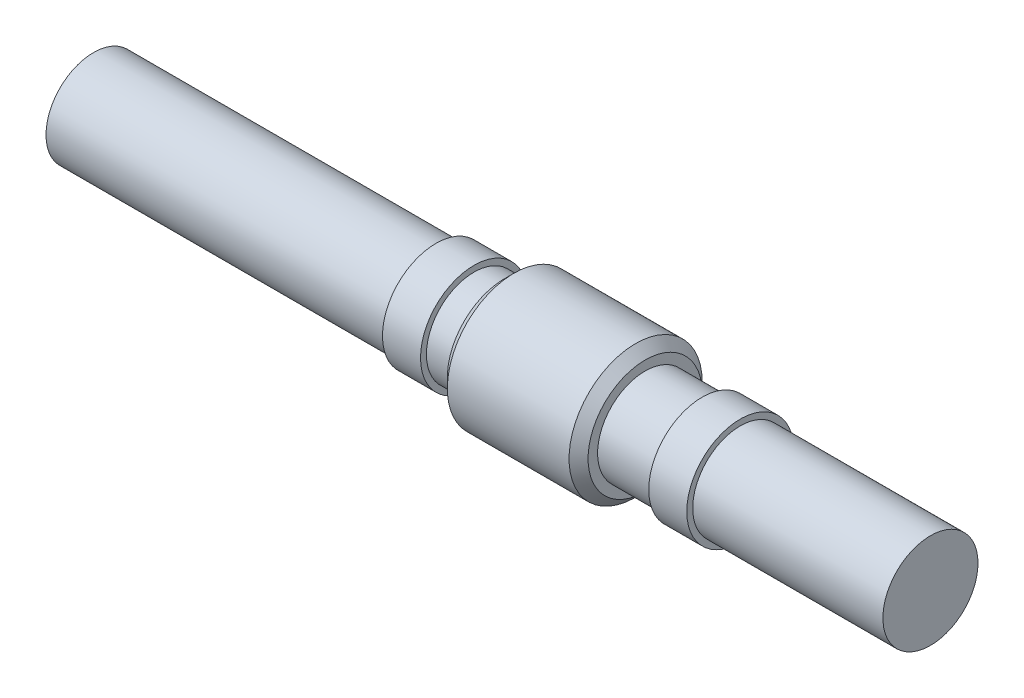
ISO-10303-21;
HEADER;
FILE_DESCRIPTION(('STEP AP214'),'2;1');
FILE_NAME('part.step','',(''),(''),'','','');
FILE_SCHEMA(('AUTOMOTIVE_DESIGN { 1 0 10303 214 1 1 1 1 }'));
ENDSEC;
DATA;
#1=APPLICATION_CONTEXT('core data for automotive mechanical design processes');
#2=APPLICATION_PROTOCOL_DEFINITION('international standard','automotive_design',2000,#1);
#3=PRODUCT_CONTEXT('',#1,'mechanical');
#4=PRODUCT('Part','Part','',(#3));
#5=PRODUCT_RELATED_PRODUCT_CATEGORY('part','',(#4));
#6=PRODUCT_DEFINITION_FORMATION('','',#4);
#7=PRODUCT_DEFINITION_CONTEXT('part definition',#1,'design');
#8=PRODUCT_DEFINITION('design','',#6,#7);
#9=PRODUCT_DEFINITION_SHAPE('','',#8);
#10=(LENGTH_UNIT() NAMED_UNIT(*) SI_UNIT(.MILLI.,.METRE.));
#11=(NAMED_UNIT(*) PLANE_ANGLE_UNIT() SI_UNIT($,.RADIAN.));
#12=(NAMED_UNIT(*) SI_UNIT($,.STERADIAN.) SOLID_ANGLE_UNIT());
#13=UNCERTAINTY_MEASURE_WITH_UNIT(LENGTH_MEASURE(1.E-05),#10,'distance_accuracy_value','');
#14=(GEOMETRIC_REPRESENTATION_CONTEXT(3) GLOBAL_UNCERTAINTY_ASSIGNED_CONTEXT((#13)) GLOBAL_UNIT_ASSIGNED_CONTEXT((#10,
#11,#12)) REPRESENTATION_CONTEXT('',''));
#15=CARTESIAN_POINT('',(0.,0.,0.));
#16=DIRECTION('',(0.,0.,1.));
#17=DIRECTION('',(1.,0.,0.));
#18=AXIS2_PLACEMENT_3D('',#15,#16,#17);
#19=CARTESIAN_POINT('',(187.,0.,0.));
#20=DIRECTION('',(-1.,0.,0.));
#21=DIRECTION('',(0.,0.,1.));
#22=AXIS2_PLACEMENT_3D('',#19,#20,#21);
#23=CYLINDRICAL_SURFACE('',#22,28.1);
#24=CARTESIAN_POINT('',(67.,0.,0.));
#25=DIRECTION('',(1.,0.,0.));
#26=DIRECTION('',(0.,0.,-1.));
#27=AXIS2_PLACEMENT_3D('',#24,#25,#26);
#28=CIRCLE('',#27,28.1);
#29=CARTESIAN_POINT('',(67.,0.,28.1));
#30=VERTEX_POINT('',#29);
#31=EDGE_CURVE('E273',#30,#30,#28,.T.);
#32=CARTESIAN_POINT('',(87.,0.,0.));
#33=DIRECTION('',(1.,0.,0.));
#34=DIRECTION('',(0.,0.,-1.));
#35=AXIS2_PLACEMENT_3D('',#32,#33,#34);
#36=CIRCLE('',#35,28.1);
#37=CARTESIAN_POINT('',(87.,0.,28.1));
#38=VERTEX_POINT('',#37);
#39=EDGE_CURVE('E264',#38,#38,#36,.T.);
#40=CARTESIAN_POINT('',(67.,0.,28.1));
#41=CARTESIAN_POINT('',(67.2083333333333,0.,28.1));
#42=CARTESIAN_POINT('',(67.4166666666667,0.,28.1));
#43=CARTESIAN_POINT('',(67.8333333333333,0.,28.1));
#44=CARTESIAN_POINT('',(68.0416666666667,0.,28.1));
#45=CARTESIAN_POINT('',(68.4583333333333,0.,28.1));
#46=CARTESIAN_POINT('',(68.6666666666667,0.,28.1));
#47=CARTESIAN_POINT('',(69.0833333333333,0.,28.1));
#48=CARTESIAN_POINT('',(69.2916666666667,0.,28.1));
#49=CARTESIAN_POINT('',(69.7083333333333,0.,28.1));
#50=CARTESIAN_POINT('',(69.9166666666667,0.,28.1));
#51=CARTESIAN_POINT('',(70.3333333333333,0.,28.1));
#52=CARTESIAN_POINT('',(70.5416666666667,0.,28.1));
#53=CARTESIAN_POINT('',(70.9583333333333,0.,28.1));
#54=CARTESIAN_POINT('',(71.1666666666667,0.,28.1));
#55=CARTESIAN_POINT('',(71.5833333333333,0.,28.1));
#56=CARTESIAN_POINT('',(71.7916666666667,0.,28.1));
#57=CARTESIAN_POINT('',(72.2083333333333,0.,28.1));
#58=CARTESIAN_POINT('',(72.4166666666667,0.,28.1));
#59=CARTESIAN_POINT('',(72.8333333333333,0.,28.1));
#60=CARTESIAN_POINT('',(73.0416666666666,0.,28.1));
#61=CARTESIAN_POINT('',(73.4583333333333,0.,28.1));
#62=CARTESIAN_POINT('',(73.6666666666666,0.,28.1));
#63=CARTESIAN_POINT('',(74.0833333333333,0.,28.1));
#64=CARTESIAN_POINT('',(74.2916666666666,0.,28.1));
#65=CARTESIAN_POINT('',(74.7083333333333,0.,28.1));
#66=CARTESIAN_POINT('',(74.9166666666666,0.,28.1));
#67=CARTESIAN_POINT('',(75.3333333333333,0.,28.1));
#68=CARTESIAN_POINT('',(75.5416666666666,0.,28.1));
#69=CARTESIAN_POINT('',(75.9583333333333,0.,28.1));
#70=CARTESIAN_POINT('',(76.1666666666666,0.,28.1));
#71=CARTESIAN_POINT('',(76.5833333333333,0.,28.1));
#72=CARTESIAN_POINT('',(76.7916666666666,0.,28.1));
#73=CARTESIAN_POINT('',(77.2083333333333,0.,28.1));
#74=CARTESIAN_POINT('',(77.4166666666666,0.,28.1));
#75=CARTESIAN_POINT('',(77.8333333333333,0.,28.1));
#76=CARTESIAN_POINT('',(78.0416666666666,0.,28.1));
#77=CARTESIAN_POINT('',(78.4583333333333,0.,28.1));
#78=CARTESIAN_POINT('',(78.6666666666666,0.,28.1));
#79=CARTESIAN_POINT('',(79.0833333333333,0.,28.1));
#80=CARTESIAN_POINT('',(79.2916666666666,0.,28.1));
#81=CARTESIAN_POINT('',(79.7083333333333,0.,28.1));
#82=CARTESIAN_POINT('',(79.9166666666666,0.,28.1));
#83=CARTESIAN_POINT('',(80.3333333333333,0.,28.1));
#84=CARTESIAN_POINT('',(80.5416666666667,0.,28.1));
#85=CARTESIAN_POINT('',(80.9583333333333,0.,28.1));
#86=CARTESIAN_POINT('',(81.1666666666667,0.,28.1));
#87=CARTESIAN_POINT('',(81.5833333333333,0.,28.1));
#88=CARTESIAN_POINT('',(81.7916666666667,0.,28.1));
#89=CARTESIAN_POINT('',(82.2083333333333,0.,28.1));
#90=CARTESIAN_POINT('',(82.4166666666667,0.,28.1));
#91=CARTESIAN_POINT('',(82.8333333333333,0.,28.1));
#92=CARTESIAN_POINT('',(83.0416666666667,0.,28.1));
#93=CARTESIAN_POINT('',(83.4583333333333,0.,28.1));
#94=CARTESIAN_POINT('',(83.6666666666666,0.,28.1));
#95=CARTESIAN_POINT('',(84.0833333333333,0.,28.1));
#96=CARTESIAN_POINT('',(84.2916666666666,0.,28.1));
#97=CARTESIAN_POINT('',(84.7083333333333,0.,28.1));
#98=CARTESIAN_POINT('',(84.9166666666666,0.,28.1));
#99=CARTESIAN_POINT('',(85.3333333333333,0.,28.1));
#100=CARTESIAN_POINT('',(85.5416666666666,0.,28.1));
#101=CARTESIAN_POINT('',(85.9583333333333,0.,28.1));
#102=CARTESIAN_POINT('',(86.1666666666666,0.,28.1));
#103=CARTESIAN_POINT('',(86.5833333333333,0.,28.1));
#104=CARTESIAN_POINT('',(86.7916666666666,0.,28.1));
#105=CARTESIAN_POINT('',(87.,0.,28.1));
#106=B_SPLINE_CURVE_WITH_KNOTS('',3,(#40,#41,#42,#43,#44,#45,#46,#47,#48,#49,#50,#51,#52,#53,
#54,#55,#56,#57,#58,#59,#60,#61,#62,#63,#64,#65,#66,#67,#68,#69,#70,#71,#72,#73,#74,#75,#76,#77,
#78,#79,#80,#81,#82,#83,#84,#85,#86,#87,#88,#89,#90,#91,#92,#93,#94,#95,#96,#97,#98,#99,#100,
#101,#102,#103,#104,#105),.UNSPECIFIED.,.F.,.F.,(4,2,2,2,2,2,2,2,2,2,2,2,2,2,2,2,2,2,2,2,2,2,2,
2,2,2,2,2,2,2,2,2,4),(0.,0.625000000000001,1.25,1.875,2.5,3.125,3.75,4.375,5.,5.62499999999999,
6.24999999999999,6.87499999999999,7.49999999999999,8.12499999999999,8.74999999999999,
9.37499999999999,9.99999999999999,10.625,11.25,11.875,12.5,13.125,13.75,14.375,15.,15.625,16.25,
16.875,17.5,18.125,18.75,19.375,20.),.UNSPECIFIED.);
#107=EDGE_CURVE('BSEAM33',#30,#38,#106,.T.);
#108=ORIENTED_EDGE('',*,*,#31,.T.);
#109=ORIENTED_EDGE('',*,*,#39,.F.);
#110=ORIENTED_EDGE('',*,*,#107,.T.);
#111=ORIENTED_EDGE('',*,*,#107,.F.);
#112=EDGE_LOOP('',(#108,#110,#109,#111));
#113=FACE_BOUND('',#112,.T.);
#114=ADVANCED_FACE('F33',(#113),#23,.T.);
#115=CARTESIAN_POINT('',(-173.,0.,0.));
#116=DIRECTION('',(1.,0.,0.));
#117=DIRECTION('',(0.,0.,-1.));
#118=AXIS2_PLACEMENT_3D('',#115,#116,#117);
#119=CYLINDRICAL_SURFACE('',#118,28.1);
#120=CARTESIAN_POINT('',(-53.,0.,0.));
#121=DIRECTION('',(-1.,0.,0.));
#122=DIRECTION('',(0.,0.,1.));
#123=AXIS2_PLACEMENT_3D('',#120,#121,#122);
#124=CIRCLE('',#123,28.1);
#125=CARTESIAN_POINT('',(-53.,0.,28.1));
#126=VERTEX_POINT('',#125);
#127=EDGE_CURVE('E52',#126,#126,#124,.T.);
#128=ORIENTED_EDGE('',*,*,#127,.T.);
#129=EDGE_LOOP('',(#128));
#130=FACE_BOUND('',#129,.T.);
#131=CARTESIAN_POINT('',(-73.,0.,0.));
#132=DIRECTION('',(-1.,0.,0.));
#133=DIRECTION('',(0.,0.,1.));
#134=AXIS2_PLACEMENT_3D('',#131,#132,#133);
#135=CIRCLE('',#134,28.1);
#136=CARTESIAN_POINT('',(-73.,0.,28.1));
#137=VERTEX_POINT('',#136);
#138=EDGE_CURVE('E271',#137,#137,#135,.T.);
#139=ORIENTED_EDGE('',*,*,#138,.F.);
#140=EDGE_LOOP('',(#139));
#141=FACE_BOUND('',#140,.T.);
#142=ADVANCED_FACE('F81',(#130,#141),#119,.T.);
#143=CARTESIAN_POINT('',(37.,0.,0.));
#144=DIRECTION('',(-1.,0.,0.));
#145=DIRECTION('',(0.,0.,1.));
#146=AXIS2_PLACEMENT_3D('',#143,#144,#145);
#147=CYLINDRICAL_SURFACE('',#146,35.);
#148=CARTESIAN_POINT('',(32.,0.,0.));
#149=DIRECTION('',(1.,0.,0.));
#150=DIRECTION('',(0.,0.,-1.));
#151=AXIS2_PLACEMENT_3D('',#148,#149,#150);
#152=CIRCLE('',#151,35.);
#153=CARTESIAN_POINT('',(32.,0.,-35.));
#154=VERTEX_POINT('',#153);
#155=EDGE_CURVE('E63',#154,#154,#152,.F.);
#156=ORIENTED_EDGE('',*,*,#155,.T.);
#157=EDGE_LOOP('',(#156));
#158=FACE_BOUND('',#157,.T.);
#159=CARTESIAN_POINT('',(-32.,0.,0.));
#160=DIRECTION('',(1.,0.,0.));
#161=DIRECTION('',(0.,0.,-1.));
#162=AXIS2_PLACEMENT_3D('',#159,#160,#161);
#163=CIRCLE('',#162,35.);
#164=CARTESIAN_POINT('',(-32.,0.,-35.));
#165=VERTEX_POINT('',#164);
#166=EDGE_CURVE('E61',#165,#165,#163,.T.);
#167=ORIENTED_EDGE('',*,*,#166,.T.);
#168=EDGE_LOOP('',(#167));
#169=FACE_BOUND('',#168,.T.);
#170=ADVANCED_FACE('F78',(#158,#169),#147,.T.);
#171=CARTESIAN_POINT('',(37.,0.,0.));
#172=DIRECTION('',(1.,0.,0.));
#173=DIRECTION('',(0.,0.,-1.));
#174=AXIS2_PLACEMENT_3D('',#171,#172,#173);
#175=PLANE('',#174);
#176=CARTESIAN_POINT('',(37.,0.,0.));
#177=DIRECTION('',(1.,0.,0.));
#178=DIRECTION('',(0.,0.,-1.));
#179=AXIS2_PLACEMENT_3D('',#176,#177,#178);
#180=CIRCLE('',#179,25.);
#181=CARTESIAN_POINT('',(37.,0.,-25.));
#182=VERTEX_POINT('',#181);
#183=EDGE_CURVE('E10',#182,#182,#180,.T.);
#184=ORIENTED_EDGE('',*,*,#183,.F.);
#185=EDGE_LOOP('',(#184));
#186=FACE_BOUND('',#185,.T.);
#187=CARTESIAN_POINT('',(37.,0.,0.));
#188=DIRECTION('',(1.,0.,0.));
#189=DIRECTION('',(0.,0.,-1.));
#190=AXIS2_PLACEMENT_3D('',#187,#188,#189);
#191=CIRCLE('',#190,30.);
#192=CARTESIAN_POINT('',(37.,0.,-30.));
#193=VERTEX_POINT('',#192);
#194=EDGE_CURVE('E57',#193,#193,#191,.T.);
#195=ORIENTED_EDGE('',*,*,#194,.T.);
#196=EDGE_LOOP('',(#195));
#197=FACE_BOUND('',#196,.T.);
#198=ADVANCED_FACE('F80',(#186,#197),#175,.T.);
#199=CARTESIAN_POINT('',(-37.,0.,0.));
#200=DIRECTION('',(1.,0.,0.));
#201=DIRECTION('',(0.,0.,-1.));
#202=AXIS2_PLACEMENT_3D('',#199,#200,#201);
#203=PLANE('',#202);
#204=CARTESIAN_POINT('',(-37.,0.,0.));
#205=DIRECTION('',(-1.,0.,0.));
#206=DIRECTION('',(0.,0.,1.));
#207=AXIS2_PLACEMENT_3D('',#204,#205,#206);
#208=CIRCLE('',#207,25.);
#209=CARTESIAN_POINT('',(-37.,0.,25.));
#210=VERTEX_POINT('',#209);
#211=EDGE_CURVE('E42',#210,#210,#208,.T.);
#212=ORIENTED_EDGE('',*,*,#211,.F.);
#213=EDGE_LOOP('',(#212));
#214=FACE_BOUND('',#213,.T.);
#215=CARTESIAN_POINT('',(-37.,0.,0.));
#216=DIRECTION('',(1.,0.,0.));
#217=DIRECTION('',(0.,0.,-1.));
#218=AXIS2_PLACEMENT_3D('',#215,#216,#217);
#219=CIRCLE('',#218,30.);
#220=CARTESIAN_POINT('',(-37.,0.,-30.));
#221=VERTEX_POINT('',#220);
#222=EDGE_CURVE('E38',#221,#221,#219,.F.);
#223=ORIENTED_EDGE('',*,*,#222,.T.);
#224=EDGE_LOOP('',(#223));
#225=FACE_BOUND('',#224,.T.);
#226=ADVANCED_FACE('F70',(#214,#225),#203,.F.);
#227=CARTESIAN_POINT('',(37.,0.,0.));
#228=DIRECTION('',(-1.,0.,0.));
#229=DIRECTION('',(0.,0.,1.));
#230=AXIS2_PLACEMENT_3D('',#227,#228,#229);
#231=CONICAL_SURFACE('',#230,30.,0.785398163397446);
#232=ORIENTED_EDGE('',*,*,#155,.F.);
#233=EDGE_LOOP('',(#232));
#234=FACE_BOUND('',#233,.T.);
#235=ORIENTED_EDGE('',*,*,#194,.F.);
#236=EDGE_LOOP('',(#235));
#237=FACE_BOUND('',#236,.T.);
#238=ADVANCED_FACE('F75',(#234,#237),#231,.T.);
#239=CARTESIAN_POINT('',(-32.,0.,0.));
#240=DIRECTION('',(1.,0.,0.));
#241=DIRECTION('',(0.,0.,-1.));
#242=AXIS2_PLACEMENT_3D('',#239,#240,#241);
#243=CONICAL_SURFACE('',#242,35.,0.78539816339745);
#244=ORIENTED_EDGE('',*,*,#222,.F.);
#245=EDGE_LOOP('',(#244));
#246=FACE_BOUND('',#245,.T.);
#247=ORIENTED_EDGE('',*,*,#166,.F.);
#248=EDGE_LOOP('',(#247));
#249=FACE_BOUND('',#248,.T.);
#250=ADVANCED_FACE('F36',(#246,#249),#243,.T.);
#251=CARTESIAN_POINT('',(-53.,0.,0.));
#252=DIRECTION('',(1.,0.,0.));
#253=DIRECTION('',(0.,0.,-1.));
#254=AXIS2_PLACEMENT_3D('',#251,#252,#253);
#255=CYLINDRICAL_SURFACE('',#254,25.);
#256=CARTESIAN_POINT('',(-53.,0.,0.));
#257=DIRECTION('',(-1.,0.,0.));
#258=DIRECTION('',(0.,0.,1.));
#259=AXIS2_PLACEMENT_3D('',#256,#257,#258);
#260=CIRCLE('',#259,25.);
#261=CARTESIAN_POINT('',(-53.,0.,25.));
#262=VERTEX_POINT('',#261);
#263=EDGE_CURVE('E55',#262,#262,#260,.T.);
#264=ORIENTED_EDGE('',*,*,#263,.F.);
#265=EDGE_LOOP('',(#264));
#266=FACE_BOUND('',#265,.T.);
#267=ORIENTED_EDGE('',*,*,#211,.T.);
#268=EDGE_LOOP('',(#267));
#269=FACE_BOUND('',#268,.T.);
#270=ADVANCED_FACE('F74',(#266,#269),#255,.T.);
#271=CARTESIAN_POINT('',(-53.,0.,0.));
#272=DIRECTION('',(-1.,0.,0.));
#273=DIRECTION('',(0.,0.,1.));
#274=AXIS2_PLACEMENT_3D('',#271,#272,#273);
#275=PLANE('',#274);
#276=ORIENTED_EDGE('',*,*,#263,.T.);
#277=EDGE_LOOP('',(#276));
#278=FACE_BOUND('',#277,.T.);
#279=ORIENTED_EDGE('',*,*,#127,.F.);
#280=EDGE_LOOP('',(#279));
#281=FACE_BOUND('',#280,.T.);
#282=ADVANCED_FACE('F106',(#278,#281),#275,.F.);
#283=CARTESIAN_POINT('',(67.,0.,0.));
#284=DIRECTION('',(-1.,0.,0.));
#285=DIRECTION('',(0.,0.,1.));
#286=AXIS2_PLACEMENT_3D('',#283,#284,#285);
#287=CYLINDRICAL_SURFACE('',#286,25.);
#288=CARTESIAN_POINT('',(67.,0.,0.));
#289=DIRECTION('',(1.,0.,0.));
#290=DIRECTION('',(0.,0.,-1.));
#291=AXIS2_PLACEMENT_3D('',#288,#289,#290);
#292=CIRCLE('',#291,25.);
#293=CARTESIAN_POINT('',(67.,0.,-25.));
#294=VERTEX_POINT('',#293);
#295=EDGE_CURVE('E50',#294,#294,#292,.T.);
#296=ORIENTED_EDGE('',*,*,#295,.F.);
#297=EDGE_LOOP('',(#296));
#298=FACE_BOUND('',#297,.T.);
#299=ORIENTED_EDGE('',*,*,#183,.T.);
#300=EDGE_LOOP('',(#299));
#301=FACE_BOUND('',#300,.T.);
#302=ADVANCED_FACE('F103',(#298,#301),#287,.T.);
#303=CARTESIAN_POINT('',(67.,0.,0.));
#304=DIRECTION('',(1.,0.,0.));
#305=DIRECTION('',(0.,0.,-1.));
#306=AXIS2_PLACEMENT_3D('',#303,#304,#305);
#307=PLANE('',#306);
#308=ORIENTED_EDGE('',*,*,#295,.T.);
#309=EDGE_LOOP('',(#308));
#310=FACE_BOUND('',#309,.T.);
#311=ORIENTED_EDGE('',*,*,#31,.F.);
#312=EDGE_LOOP('',(#311));
#313=FACE_BOUND('',#312,.T.);
#314=ADVANCED_FACE('F101',(#310,#313),#307,.F.);
#315=CARTESIAN_POINT('',(-73.,0.,0.));
#316=DIRECTION('',(-1.,0.,0.));
#317=DIRECTION('',(0.,0.,1.));
#318=AXIS2_PLACEMENT_3D('',#315,#316,#317);
#319=PLANE('',#318);
#320=CARTESIAN_POINT('',(-73.,0.,0.));
#321=DIRECTION('',(-1.,0.,0.));
#322=DIRECTION('',(0.,0.,1.));
#323=AXIS2_PLACEMENT_3D('',#320,#321,#322);
#324=CIRCLE('',#323,25.);
#325=CARTESIAN_POINT('',(-73.,0.,25.));
#326=VERTEX_POINT('',#325);
#327=EDGE_CURVE('E268',#326,#326,#324,.T.);
#328=ORIENTED_EDGE('',*,*,#327,.F.);
#329=EDGE_LOOP('',(#328));
#330=FACE_BOUND('',#329,.T.);
#331=ORIENTED_EDGE('',*,*,#138,.T.);
#332=EDGE_LOOP('',(#331));
#333=FACE_BOUND('',#332,.T.);
#334=ADVANCED_FACE('F154',(#330,#333),#319,.T.);
#335=CARTESIAN_POINT('',(-73.,0.,0.));
#336=DIRECTION('',(-1.,0.,0.));
#337=DIRECTION('',(0.,0.,1.));
#338=AXIS2_PLACEMENT_3D('',#335,#336,#337);
#339=CYLINDRICAL_SURFACE('',#338,25.);
#340=ORIENTED_EDGE('',*,*,#327,.T.);
#341=EDGE_LOOP('',(#340));
#342=FACE_BOUND('',#341,.T.);
#343=CARTESIAN_POINT('',(-253.,2.80331313717852E-12,-7.42938336984118E-12));
#344=DIRECTION('',(-1.,0.,0.));
#345=DIRECTION('',(0.,0.,1.));
#346=AXIS2_PLACEMENT_3D('',#343,#344,#345);
#347=CIRCLE('',#346,25.0000000000048);
#348=CARTESIAN_POINT('',(-253.,2.80331313717852E-12,24.9999999999974));
#349=VERTEX_POINT('',#348);
#350=EDGE_CURVE('E255',#349,#349,#347,.T.);
#351=ORIENTED_EDGE('',*,*,#350,.F.);
#352=EDGE_LOOP('',(#351));
#353=FACE_BOUND('',#352,.T.);
#354=ADVANCED_FACE('F162',(#342,#353),#339,.T.);
#355=CARTESIAN_POINT('',(87.,0.,0.));
#356=DIRECTION('',(1.,0.,0.));
#357=DIRECTION('',(0.,0.,-1.));
#358=AXIS2_PLACEMENT_3D('',#355,#356,#357);
#359=PLANE('',#358);
#360=CARTESIAN_POINT('',(87.,0.,0.));
#361=DIRECTION('',(1.,0.,0.));
#362=DIRECTION('',(0.,0.,-1.));
#363=AXIS2_PLACEMENT_3D('',#360,#361,#362);
#364=CIRCLE('',#363,25.);
#365=CARTESIAN_POINT('',(87.,0.,-25.));
#366=VERTEX_POINT('',#365);
#367=EDGE_CURVE('E260',#366,#366,#364,.T.);
#368=ORIENTED_EDGE('',*,*,#367,.F.);
#369=EDGE_LOOP('',(#368));
#370=FACE_BOUND('',#369,.T.);
#371=ORIENTED_EDGE('',*,*,#39,.T.);
#372=EDGE_LOOP('',(#371));
#373=FACE_BOUND('',#372,.T.);
#374=ADVANCED_FACE('F167',(#370,#373),#359,.T.);
#375=CARTESIAN_POINT('',(87.,0.,0.));
#376=DIRECTION('',(1.,0.,0.));
#377=DIRECTION('',(0.,0.,-1.));
#378=AXIS2_PLACEMENT_3D('',#375,#376,#377);
#379=CYLINDRICAL_SURFACE('',#378,25.);
#380=ORIENTED_EDGE('',*,*,#367,.T.);
#381=EDGE_LOOP('',(#380));
#382=FACE_BOUND('',#381,.T.);
#383=CARTESIAN_POINT('',(187.,0.,0.));
#384=DIRECTION('',(1.,0.,0.));
#385=DIRECTION('',(0.,0.,-1.));
#386=AXIS2_PLACEMENT_3D('',#383,#384,#385);
#387=CIRCLE('',#386,25.);
#388=CARTESIAN_POINT('',(187.,0.,-25.));
#389=VERTEX_POINT('',#388);
#390=EDGE_CURVE('E257',#389,#389,#387,.T.);
#391=ORIENTED_EDGE('',*,*,#390,.F.);
#392=EDGE_LOOP('',(#391));
#393=FACE_BOUND('',#392,.T.);
#394=ADVANCED_FACE('F171',(#382,#393),#379,.T.);
#395=CARTESIAN_POINT('',(187.,0.,0.));
#396=DIRECTION('',(1.,0.,0.));
#397=DIRECTION('',(0.,0.,-1.));
#398=AXIS2_PLACEMENT_3D('',#395,#396,#397);
#399=PLANE('',#398);
#400=ORIENTED_EDGE('',*,*,#390,.T.);
#401=EDGE_LOOP('',(#400));
#402=FACE_BOUND('',#401,.T.);
#403=ADVANCED_FACE('F179',(#402),#399,.T.);
#404=CARTESIAN_POINT('',(-253.,2.80331313717852E-12,-7.42938336984118E-12));
#405=DIRECTION('',(-1.,0.,0.));
#406=DIRECTION('',(0.,0.,1.));
#407=AXIS2_PLACEMENT_3D('',#404,#405,#406);
#408=PLANE('',#407);
#409=ORIENTED_EDGE('',*,*,#350,.T.);
#410=EDGE_LOOP('',(#409));
#411=FACE_BOUND('',#410,.T.);
#412=ADVANCED_FACE('F187',(#411),#408,.T.);
#413=CLOSED_SHELL('',(#114,#142,#170,#198,#226,#238,#250,#270,#282,#302,#314,#334,#354,#374,
#394,#403,#412));
#414=MANIFOLD_SOLID_BREP('B2',#413);
#415=ADVANCED_BREP_SHAPE_REPRESENTATION('',(#18,#414),#14);
#416=SHAPE_DEFINITION_REPRESENTATION(#9,#415);
ENDSEC;
END-ISO-10303-21;
